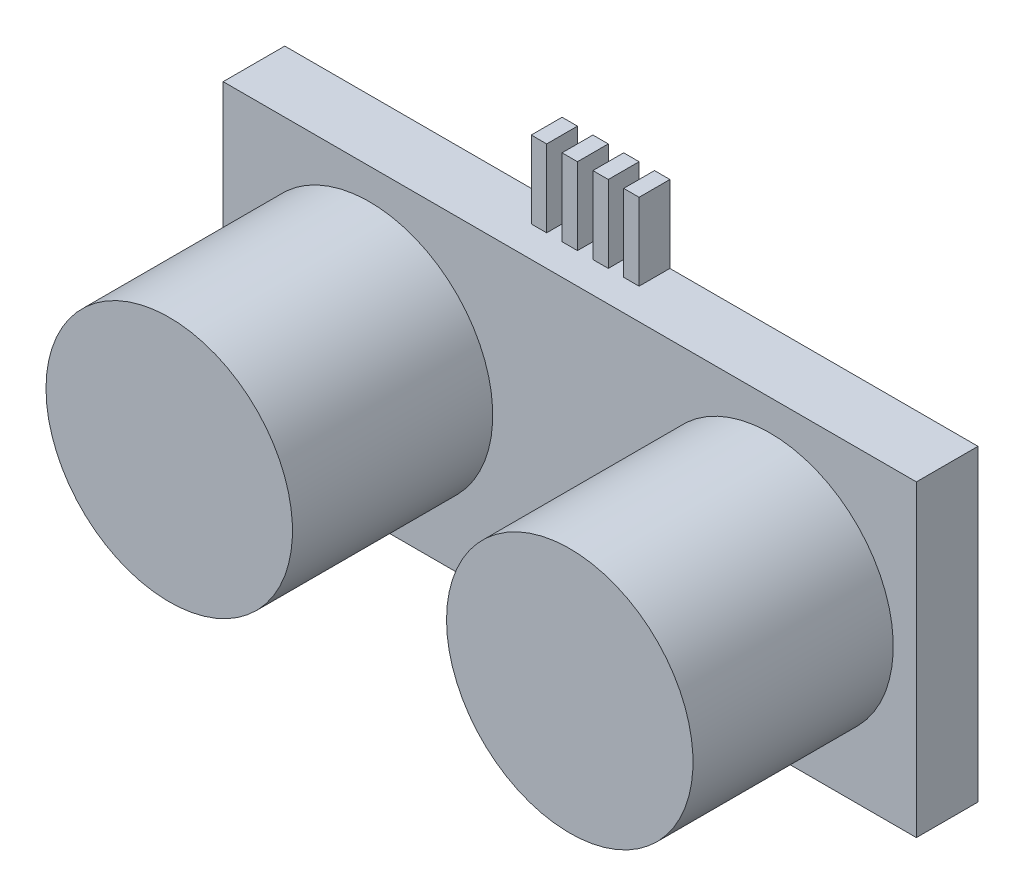
ISO-10303-21;
HEADER;
FILE_DESCRIPTION(('STEP AP214'),'2;1');
FILE_NAME('part.step','',(''),(''),'','','');
FILE_SCHEMA(('AUTOMOTIVE_DESIGN { 1 0 10303 214 1 1 1 1 }'));
ENDSEC;
DATA;
#1=APPLICATION_CONTEXT('core data for automotive mechanical design processes');
#2=APPLICATION_PROTOCOL_DEFINITION('international standard','automotive_design',2000,#1);
#3=PRODUCT_CONTEXT('',#1,'mechanical');
#4=PRODUCT('Part','Part','',(#3));
#5=PRODUCT_RELATED_PRODUCT_CATEGORY('part','',(#4));
#6=PRODUCT_DEFINITION_FORMATION('','',#4);
#7=PRODUCT_DEFINITION_CONTEXT('part definition',#1,'design');
#8=PRODUCT_DEFINITION('design','',#6,#7);
#9=PRODUCT_DEFINITION_SHAPE('','',#8);
#10=(LENGTH_UNIT() NAMED_UNIT(*) SI_UNIT(.MILLI.,.METRE.));
#11=(NAMED_UNIT(*) PLANE_ANGLE_UNIT() SI_UNIT($,.RADIAN.));
#12=(NAMED_UNIT(*) SI_UNIT($,.STERADIAN.) SOLID_ANGLE_UNIT());
#13=UNCERTAINTY_MEASURE_WITH_UNIT(LENGTH_MEASURE(1.E-05),#10,'distance_accuracy_value','');
#14=(GEOMETRIC_REPRESENTATION_CONTEXT(3) GLOBAL_UNCERTAINTY_ASSIGNED_CONTEXT((#13)) GLOBAL_UNIT_ASSIGNED_CONTEXT((#10,
#11,#12)) REPRESENTATION_CONTEXT('',''));
#15=CARTESIAN_POINT('',(0.,0.,0.));
#16=DIRECTION('',(0.,0.,1.));
#17=DIRECTION('',(1.,0.,0.));
#18=AXIS2_PLACEMENT_3D('',#15,#16,#17);
#19=CARTESIAN_POINT('',(-22.5,10.,4.));
#20=DIRECTION('',(0.,-1.,0.));
#21=DIRECTION('',(0.,0.,-1.));
#22=AXIS2_PLACEMENT_3D('',#19,#20,#21);
#23=PLANE('',#22);
#24=DIRECTION('',(-1.,0.,0.));
#25=VECTOR('',#24,1.);
#26=CARTESIAN_POINT('',(2.5,9.99999999999999,2.));
#27=LINE('',#26,#25);
#28=CARTESIAN_POINT('',(2.5,10.,2.));
#29=VERTEX_POINT('',#28);
#30=CARTESIAN_POINT('',(1.5,10.,2.));
#31=VERTEX_POINT('',#30);
#32=EDGE_CURVE('E52',#29,#31,#27,.T.);
#33=ORIENTED_EDGE('',*,*,#32,.T.);
#34=DIRECTION('',(0.,0.,-1.));
#35=VECTOR('',#34,1.);
#36=CARTESIAN_POINT('',(1.5,9.99999999999999,2.));
#37=LINE('',#36,#35);
#38=CARTESIAN_POINT('',(1.5,9.99999999999999,0.));
#39=VERTEX_POINT('',#38);
#40=EDGE_CURVE('E202',#31,#39,#37,.T.);
#41=ORIENTED_EDGE('',*,*,#40,.T.);
#42=DIRECTION('',(-1.,0.,0.));
#43=VECTOR('',#42,1.);
#44=CARTESIAN_POINT('',(-22.5,10.,0.));
#45=LINE('',#44,#43);
#46=CARTESIAN_POINT('',(0.499999999999999,10.,0.));
#47=VERTEX_POINT('',#46);
#48=EDGE_CURVE('E319',#39,#47,#45,.T.);
#49=ORIENTED_EDGE('',*,*,#48,.T.);
#50=DIRECTION('',(0.,0.,-1.));
#51=VECTOR('',#50,1.);
#52=CARTESIAN_POINT('',(0.499999999999999,10.,2.));
#53=LINE('',#52,#51);
#54=CARTESIAN_POINT('',(0.499999999999999,10.,2.));
#55=VERTEX_POINT('',#54);
#56=EDGE_CURVE('E292',#55,#47,#53,.T.);
#57=ORIENTED_EDGE('',*,*,#56,.F.);
#58=DIRECTION('',(-1.,0.,0.));
#59=VECTOR('',#58,1.);
#60=CARTESIAN_POINT('',(0.499999999999999,10.,2.));
#61=LINE('',#60,#59);
#62=CARTESIAN_POINT('',(-0.500000000000001,10.,2.));
#63=VERTEX_POINT('',#62);
#64=EDGE_CURVE('E271',#55,#63,#61,.T.);
#65=ORIENTED_EDGE('',*,*,#64,.T.);
#66=DIRECTION('',(0.,0.,-1.));
#67=VECTOR('',#66,1.);
#68=CARTESIAN_POINT('',(-0.500000000000001,10.,2.));
#69=LINE('',#68,#67);
#70=CARTESIAN_POINT('',(-0.500000000000007,10.,0.));
#71=VERTEX_POINT('',#70);
#72=EDGE_CURVE('E289',#63,#71,#69,.T.);
#73=ORIENTED_EDGE('',*,*,#72,.T.);
#74=CARTESIAN_POINT('',(-1.50000000000001,10.,0.));
#75=VERTEX_POINT('',#74);
#76=EDGE_CURVE('E320',#71,#75,#45,.T.);
#77=ORIENTED_EDGE('',*,*,#76,.T.);
#78=DIRECTION('',(0.,0.,-1.));
#79=VECTOR('',#78,1.);
#80=CARTESIAN_POINT('',(-1.5,10.,2.));
#81=LINE('',#80,#79);
#82=CARTESIAN_POINT('',(-1.5,10.,2.));
#83=VERTEX_POINT('',#82);
#84=EDGE_CURVE('E261',#83,#75,#81,.T.);
#85=ORIENTED_EDGE('',*,*,#84,.F.);
#86=DIRECTION('',(-1.,0.,0.));
#87=VECTOR('',#86,1.);
#88=CARTESIAN_POINT('',(-1.5,10.,2.));
#89=LINE('',#88,#87);
#90=CARTESIAN_POINT('',(-2.5,10.,2.));
#91=VERTEX_POINT('',#90);
#92=EDGE_CURVE('E241',#83,#91,#89,.T.);
#93=ORIENTED_EDGE('',*,*,#92,.T.);
#94=DIRECTION('',(0.,0.,-1.));
#95=VECTOR('',#94,1.);
#96=CARTESIAN_POINT('',(-2.5,10.,2.));
#97=LINE('',#96,#95);
#98=CARTESIAN_POINT('',(-2.5,10.,0.));
#99=VERTEX_POINT('',#98);
#100=EDGE_CURVE('E258',#91,#99,#97,.T.);
#101=ORIENTED_EDGE('',*,*,#100,.T.);
#102=CARTESIAN_POINT('',(-3.50000000000001,10.,0.));
#103=VERTEX_POINT('',#102);
#104=EDGE_CURVE('E379',#99,#103,#45,.T.);
#105=ORIENTED_EDGE('',*,*,#104,.T.);
#106=DIRECTION('',(0.,0.,-1.));
#107=VECTOR('',#106,1.);
#108=CARTESIAN_POINT('',(-3.5,10.,2.));
#109=LINE('',#108,#107);
#110=CARTESIAN_POINT('',(-3.5,10.,2.));
#111=VERTEX_POINT('',#110);
#112=EDGE_CURVE('E231',#111,#103,#109,.T.);
#113=ORIENTED_EDGE('',*,*,#112,.F.);
#114=DIRECTION('',(-1.,0.,0.));
#115=VECTOR('',#114,1.);
#116=CARTESIAN_POINT('',(-3.5,10.,2.));
#117=LINE('',#116,#115);
#118=CARTESIAN_POINT('',(-4.5,10.,2.));
#119=VERTEX_POINT('',#118);
#120=EDGE_CURVE('E211',#111,#119,#117,.T.);
#121=ORIENTED_EDGE('',*,*,#120,.T.);
#122=DIRECTION('',(0.,0.,-1.));
#123=VECTOR('',#122,1.);
#124=CARTESIAN_POINT('',(-4.5,10.,2.));
#125=LINE('',#124,#123);
#126=CARTESIAN_POINT('',(-4.5,10.,0.));
#127=VERTEX_POINT('',#126);
#128=EDGE_CURVE('E228',#119,#127,#125,.T.);
#129=ORIENTED_EDGE('',*,*,#128,.T.);
#130=CARTESIAN_POINT('',(-22.5,10.,0.));
#131=VERTEX_POINT('',#130);
#132=EDGE_CURVE('E315',#127,#131,#45,.T.);
#133=ORIENTED_EDGE('',*,*,#132,.T.);
#134=DIRECTION('',(0.,0.,-1.));
#135=VECTOR('',#134,1.);
#136=CARTESIAN_POINT('',(-22.5,10.,4.));
#137=LINE('',#136,#135);
#138=CARTESIAN_POINT('',(-22.5,10.,4.));
#139=VERTEX_POINT('',#138);
#140=EDGE_CURVE('E328',#139,#131,#137,.T.);
#141=ORIENTED_EDGE('',*,*,#140,.F.);
#142=DIRECTION('',(-1.,0.,0.));
#143=VECTOR('',#142,1.);
#144=CARTESIAN_POINT('',(-22.5,10.,4.));
#145=LINE('',#144,#143);
#146=CARTESIAN_POINT('',(22.5,10.,4.));
#147=VERTEX_POINT('',#146);
#148=EDGE_CURVE('E305',#147,#139,#145,.T.);
#149=ORIENTED_EDGE('',*,*,#148,.F.);
#150=DIRECTION('',(0.,0.,-1.));
#151=VECTOR('',#150,1.);
#152=CARTESIAN_POINT('',(22.5,10.,4.));
#153=LINE('',#152,#151);
#154=CARTESIAN_POINT('',(22.5,10.,0.));
#155=VERTEX_POINT('',#154);
#156=EDGE_CURVE('E331',#147,#155,#153,.T.);
#157=ORIENTED_EDGE('',*,*,#156,.T.);
#158=CARTESIAN_POINT('',(2.49999999999999,10.,0.));
#159=VERTEX_POINT('',#158);
#160=EDGE_CURVE('E316',#155,#159,#45,.T.);
#161=ORIENTED_EDGE('',*,*,#160,.T.);
#162=DIRECTION('',(0.,0.,-1.));
#163=VECTOR('',#162,1.);
#164=CARTESIAN_POINT('',(2.5,9.99999999999999,2.));
#165=LINE('',#164,#163);
#166=EDGE_CURVE('E48',#29,#159,#165,.T.);
#167=ORIENTED_EDGE('',*,*,#166,.F.);
#168=EDGE_LOOP('',(#33,#41,#49,#57,#65,#73,#77,#85,#93,#101,#105,#113,#121,#129,#133,#141,#149,
#157,#161,#167));
#169=FACE_BOUND('',#168,.T.);
#170=ADVANCED_FACE('F33',(#169),#23,.F.);
#171=CARTESIAN_POINT('',(22.5,-10.,4.));
#172=DIRECTION('',(-1.,0.,0.));
#173=DIRECTION('',(0.,0.,1.));
#174=AXIS2_PLACEMENT_3D('',#171,#172,#173);
#175=PLANE('',#174);
#176=DIRECTION('',(0.,1.,0.));
#177=VECTOR('',#176,1.);
#178=CARTESIAN_POINT('',(22.5,-10.,0.));
#179=LINE('',#178,#177);
#180=CARTESIAN_POINT('',(22.5,-10.,0.));
#181=VERTEX_POINT('',#180);
#182=EDGE_CURVE('E301',#181,#155,#179,.T.);
#183=ORIENTED_EDGE('',*,*,#182,.T.);
#184=ORIENTED_EDGE('',*,*,#156,.F.);
#185=DIRECTION('',(0.,1.,0.));
#186=VECTOR('',#185,1.);
#187=CARTESIAN_POINT('',(22.5,-10.,4.));
#188=LINE('',#187,#186);
#189=CARTESIAN_POINT('',(22.5,-10.,4.));
#190=VERTEX_POINT('',#189);
#191=EDGE_CURVE('E302',#190,#147,#188,.T.);
#192=ORIENTED_EDGE('',*,*,#191,.F.);
#193=DIRECTION('',(0.,0.,-1.));
#194=VECTOR('',#193,1.);
#195=CARTESIAN_POINT('',(22.5,-10.,4.));
#196=LINE('',#195,#194);
#197=EDGE_CURVE('E312',#190,#181,#196,.T.);
#198=ORIENTED_EDGE('',*,*,#197,.T.);
#199=EDGE_LOOP('',(#183,#184,#192,#198));
#200=FACE_BOUND('',#199,.T.);
#201=ADVANCED_FACE('F35',(#200),#175,.F.);
#202=CARTESIAN_POINT('',(-22.5,-10.,4.));
#203=DIRECTION('',(1.,0.,0.));
#204=DIRECTION('',(0.,0.,-1.));
#205=AXIS2_PLACEMENT_3D('',#202,#203,#204);
#206=PLANE('',#205);
#207=DIRECTION('',(0.,-1.,0.));
#208=VECTOR('',#207,1.);
#209=CARTESIAN_POINT('',(-22.5,-10.,0.));
#210=LINE('',#209,#208);
#211=CARTESIAN_POINT('',(-22.5,-10.,0.));
#212=VERTEX_POINT('',#211);
#213=EDGE_CURVE('E318',#131,#212,#210,.T.);
#214=ORIENTED_EDGE('',*,*,#213,.T.);
#215=DIRECTION('',(0.,0.,-1.));
#216=VECTOR('',#215,1.);
#217=CARTESIAN_POINT('',(-22.5,-10.,4.));
#218=LINE('',#217,#216);
#219=CARTESIAN_POINT('',(-22.5,-10.,4.));
#220=VERTEX_POINT('',#219);
#221=EDGE_CURVE('E325',#220,#212,#218,.T.);
#222=ORIENTED_EDGE('',*,*,#221,.F.);
#223=DIRECTION('',(0.,-1.,0.));
#224=VECTOR('',#223,1.);
#225=CARTESIAN_POINT('',(-22.5,-10.,4.));
#226=LINE('',#225,#224);
#227=EDGE_CURVE('E308',#139,#220,#226,.T.);
#228=ORIENTED_EDGE('',*,*,#227,.F.);
#229=ORIENTED_EDGE('',*,*,#140,.T.);
#230=EDGE_LOOP('',(#214,#222,#228,#229));
#231=FACE_BOUND('',#230,.T.);
#232=ADVANCED_FACE('F356',(#231),#206,.F.);
#233=CARTESIAN_POINT('',(-22.5,-10.,4.));
#234=DIRECTION('',(0.,1.,0.));
#235=DIRECTION('',(0.,0.,1.));
#236=AXIS2_PLACEMENT_3D('',#233,#234,#235);
#237=PLANE('',#236);
#238=DIRECTION('',(1.,0.,0.));
#239=VECTOR('',#238,1.);
#240=CARTESIAN_POINT('',(-22.5,-10.,0.));
#241=LINE('',#240,#239);
#242=EDGE_CURVE('E306',#212,#181,#241,.T.);
#243=ORIENTED_EDGE('',*,*,#242,.T.);
#244=ORIENTED_EDGE('',*,*,#197,.F.);
#245=DIRECTION('',(1.,0.,0.));
#246=VECTOR('',#245,1.);
#247=CARTESIAN_POINT('',(-22.5,-10.,4.));
#248=LINE('',#247,#246);
#249=EDGE_CURVE('E310',#220,#190,#248,.T.);
#250=ORIENTED_EDGE('',*,*,#249,.F.);
#251=ORIENTED_EDGE('',*,*,#221,.T.);
#252=EDGE_LOOP('',(#243,#244,#250,#251));
#253=FACE_BOUND('',#252,.T.);
#254=ADVANCED_FACE('F342',(#253),#237,.F.);
#255=CARTESIAN_POINT('',(0.,0.,4.));
#256=DIRECTION('',(0.,0.,-1.));
#257=DIRECTION('',(-1.,0.,0.));
#258=AXIS2_PLACEMENT_3D('',#255,#256,#257);
#259=PLANE('',#258);
#260=CARTESIAN_POINT('',(13.,0.,4.));
#261=DIRECTION('',(0.,0.,-1.));
#262=DIRECTION('',(-1.,0.,0.));
#263=AXIS2_PLACEMENT_3D('',#260,#261,#262);
#264=CIRCLE('',#263,8.);
#265=CARTESIAN_POINT('',(5.,0.,4.));
#266=VERTEX_POINT('',#265);
#267=EDGE_CURVE('E11',#266,#266,#264,.F.);
#268=ORIENTED_EDGE('',*,*,#267,.F.);
#269=EDGE_LOOP('',(#268));
#270=FACE_BOUND('',#269,.T.);
#271=CARTESIAN_POINT('',(-13.,0.,4.));
#272=DIRECTION('',(0.,0.,-1.));
#273=DIRECTION('',(-1.,0.,0.));
#274=AXIS2_PLACEMENT_3D('',#271,#272,#273);
#275=CIRCLE('',#274,8.);
#276=CARTESIAN_POINT('',(-21.,0.,4.));
#277=VERTEX_POINT('',#276);
#278=EDGE_CURVE('E41',#277,#277,#275,.F.);
#279=ORIENTED_EDGE('',*,*,#278,.F.);
#280=EDGE_LOOP('',(#279));
#281=FACE_BOUND('',#280,.T.);
#282=ORIENTED_EDGE('',*,*,#191,.T.);
#283=ORIENTED_EDGE('',*,*,#148,.T.);
#284=ORIENTED_EDGE('',*,*,#227,.T.);
#285=ORIENTED_EDGE('',*,*,#249,.T.);
#286=EDGE_LOOP('',(#282,#283,#284,#285));
#287=FACE_BOUND('',#286,.T.);
#288=ADVANCED_FACE('F338',(#270,#281,#287),#259,.F.);
#289=CARTESIAN_POINT('',(0.,0.,0.));
#290=DIRECTION('',(0.,0.,-1.));
#291=DIRECTION('',(-1.,0.,0.));
#292=AXIS2_PLACEMENT_3D('',#289,#290,#291);
#293=PLANE('',#292);
#294=ORIENTED_EDGE('',*,*,#182,.F.);
#295=ORIENTED_EDGE('',*,*,#242,.F.);
#296=ORIENTED_EDGE('',*,*,#213,.F.);
#297=ORIENTED_EDGE('',*,*,#132,.F.);
#298=DIRECTION('',(0.,1.,0.));
#299=VECTOR('',#298,1.);
#300=CARTESIAN_POINT('',(-4.5,10.,0.));
#301=LINE('',#300,#299);
#302=CARTESIAN_POINT('',(-4.5,15.,0.));
#303=VERTEX_POINT('',#302);
#304=EDGE_CURVE('E208',#127,#303,#301,.T.);
#305=ORIENTED_EDGE('',*,*,#304,.T.);
#306=DIRECTION('',(1.,0.,0.));
#307=VECTOR('',#306,1.);
#308=CARTESIAN_POINT('',(-4.,15.,0.));
#309=LINE('',#308,#307);
#310=CARTESIAN_POINT('',(-3.5,15.,0.));
#311=VERTEX_POINT('',#310);
#312=EDGE_CURVE('E201',#303,#311,#309,.T.);
#313=ORIENTED_EDGE('',*,*,#312,.T.);
#314=DIRECTION('',(0.,-1.,0.));
#315=VECTOR('',#314,1.);
#316=CARTESIAN_POINT('',(-3.5,15.,0.));
#317=LINE('',#316,#315);
#318=EDGE_CURVE('E219',#311,#103,#317,.T.);
#319=ORIENTED_EDGE('',*,*,#318,.T.);
#320=ORIENTED_EDGE('',*,*,#104,.F.);
#321=DIRECTION('',(0.,1.,0.));
#322=VECTOR('',#321,1.);
#323=CARTESIAN_POINT('',(-2.5,10.,0.));
#324=LINE('',#323,#322);
#325=CARTESIAN_POINT('',(-2.5,15.,0.));
#326=VERTEX_POINT('',#325);
#327=EDGE_CURVE('E238',#99,#326,#324,.T.);
#328=ORIENTED_EDGE('',*,*,#327,.T.);
#329=DIRECTION('',(1.,0.,0.));
#330=VECTOR('',#329,1.);
#331=CARTESIAN_POINT('',(-2.,15.,0.));
#332=LINE('',#331,#330);
#333=CARTESIAN_POINT('',(-1.5,15.,0.));
#334=VERTEX_POINT('',#333);
#335=EDGE_CURVE('E227',#326,#334,#332,.T.);
#336=ORIENTED_EDGE('',*,*,#335,.T.);
#337=DIRECTION('',(0.,-1.,0.));
#338=VECTOR('',#337,1.);
#339=CARTESIAN_POINT('',(-1.5,15.,0.));
#340=LINE('',#339,#338);
#341=EDGE_CURVE('E249',#334,#75,#340,.T.);
#342=ORIENTED_EDGE('',*,*,#341,.T.);
#343=ORIENTED_EDGE('',*,*,#76,.F.);
#344=DIRECTION('',(0.,1.,0.));
#345=VECTOR('',#344,1.);
#346=CARTESIAN_POINT('',(-0.500000000000001,10.,0.));
#347=LINE('',#346,#345);
#348=CARTESIAN_POINT('',(-0.500000000000001,15.,0.));
#349=VERTEX_POINT('',#348);
#350=EDGE_CURVE('E268',#71,#349,#347,.T.);
#351=ORIENTED_EDGE('',*,*,#350,.T.);
#352=DIRECTION('',(1.,0.,0.));
#353=VECTOR('',#352,1.);
#354=CARTESIAN_POINT('',(0.,15.,0.));
#355=LINE('',#354,#353);
#356=CARTESIAN_POINT('',(0.5,15.,0.));
#357=VERTEX_POINT('',#356);
#358=EDGE_CURVE('E257',#349,#357,#355,.T.);
#359=ORIENTED_EDGE('',*,*,#358,.T.);
#360=DIRECTION('',(0.,-1.,0.));
#361=VECTOR('',#360,1.);
#362=CARTESIAN_POINT('',(0.5,15.,0.));
#363=LINE('',#362,#361);
#364=EDGE_CURVE('E280',#357,#47,#363,.T.);
#365=ORIENTED_EDGE('',*,*,#364,.T.);
#366=ORIENTED_EDGE('',*,*,#48,.F.);
#367=DIRECTION('',(0.,1.,0.));
#368=VECTOR('',#367,1.);
#369=CARTESIAN_POINT('',(1.5,9.99999999999999,0.));
#370=LINE('',#369,#368);
#371=CARTESIAN_POINT('',(1.5,15.,0.));
#372=VERTEX_POINT('',#371);
#373=EDGE_CURVE('E180',#39,#372,#370,.T.);
#374=ORIENTED_EDGE('',*,*,#373,.T.);
#375=DIRECTION('',(1.,0.,0.));
#376=VECTOR('',#375,1.);
#377=CARTESIAN_POINT('',(2.,15.,0.));
#378=LINE('',#377,#376);
#379=CARTESIAN_POINT('',(2.5,15.,0.));
#380=VERTEX_POINT('',#379);
#381=EDGE_CURVE('E195',#372,#380,#378,.T.);
#382=ORIENTED_EDGE('',*,*,#381,.T.);
#383=DIRECTION('',(0.,-1.,0.));
#384=VECTOR('',#383,1.);
#385=CARTESIAN_POINT('',(2.5,15.,0.));
#386=LINE('',#385,#384);
#387=EDGE_CURVE('E186',#380,#159,#386,.T.);
#388=ORIENTED_EDGE('',*,*,#387,.T.);
#389=ORIENTED_EDGE('',*,*,#160,.F.);
#390=EDGE_LOOP('',(#294,#295,#296,#297,#305,#313,#319,#320,#328,#336,#342,#343,#351,#359,#365,
#366,#374,#382,#388,#389));
#391=FACE_BOUND('',#390,.T.);
#392=ADVANCED_FACE('F341',(#391),#293,.T.);
#393=CARTESIAN_POINT('',(-13.,0.,17.));
#394=DIRECTION('',(0.,0.,-1.));
#395=DIRECTION('',(-1.,0.,0.));
#396=AXIS2_PLACEMENT_3D('',#393,#394,#395);
#397=CYLINDRICAL_SURFACE('',#396,8.);
#398=CARTESIAN_POINT('',(-13.,0.,17.));
#399=DIRECTION('',(0.,0.,1.));
#400=DIRECTION('',(1.,0.,0.));
#401=AXIS2_PLACEMENT_3D('',#398,#399,#400);
#402=CIRCLE('',#401,8.);
#403=CARTESIAN_POINT('',(-21.,0.,17.));
#404=VERTEX_POINT('',#403);
#405=EDGE_CURVE('E298',#404,#404,#402,.T.);
#406=CARTESIAN_POINT('',(-21.,0.,17.));
#407=CARTESIAN_POINT('',(-21.,0.,16.8645833333333));
#408=CARTESIAN_POINT('',(-21.,0.,16.7291666666667));
#409=CARTESIAN_POINT('',(-21.,0.,16.4583333333333));
#410=CARTESIAN_POINT('',(-21.,0.,16.3229166666667));
#411=CARTESIAN_POINT('',(-21.,0.,16.0520833333333));
#412=CARTESIAN_POINT('',(-21.,0.,15.9166666666667));
#413=CARTESIAN_POINT('',(-21.,0.,15.6458333333333));
#414=CARTESIAN_POINT('',(-21.,0.,15.5104166666667));
#415=CARTESIAN_POINT('',(-21.,0.,15.2395833333333));
#416=CARTESIAN_POINT('',(-21.,0.,15.1041666666667));
#417=CARTESIAN_POINT('',(-21.,0.,14.8333333333333));
#418=CARTESIAN_POINT('',(-21.,0.,14.6979166666667));
#419=CARTESIAN_POINT('',(-21.,0.,14.4270833333333));
#420=CARTESIAN_POINT('',(-21.,0.,14.2916666666667));
#421=CARTESIAN_POINT('',(-21.,0.,14.0208333333333));
#422=CARTESIAN_POINT('',(-21.,0.,13.8854166666667));
#423=CARTESIAN_POINT('',(-21.,0.,13.6145833333333));
#424=CARTESIAN_POINT('',(-21.,0.,13.4791666666667));
#425=CARTESIAN_POINT('',(-21.,0.,13.2083333333333));
#426=CARTESIAN_POINT('',(-21.,0.,13.0729166666667));
#427=CARTESIAN_POINT('',(-21.,0.,12.8020833333333));
#428=CARTESIAN_POINT('',(-21.,0.,12.6666666666667));
#429=CARTESIAN_POINT('',(-21.,0.,12.3958333333333));
#430=CARTESIAN_POINT('',(-21.,0.,12.2604166666667));
#431=CARTESIAN_POINT('',(-21.,0.,11.9895833333333));
#432=CARTESIAN_POINT('',(-21.,0.,11.8541666666667));
#433=CARTESIAN_POINT('',(-21.,0.,11.5833333333333));
#434=CARTESIAN_POINT('',(-21.,0.,11.4479166666667));
#435=CARTESIAN_POINT('',(-21.,0.,11.1770833333333));
#436=CARTESIAN_POINT('',(-21.,0.,11.0416666666667));
#437=CARTESIAN_POINT('',(-21.,0.,10.7708333333333));
#438=CARTESIAN_POINT('',(-21.,0.,10.6354166666667));
#439=CARTESIAN_POINT('',(-21.,0.,10.3645833333333));
#440=CARTESIAN_POINT('',(-21.,0.,10.2291666666667));
#441=CARTESIAN_POINT('',(-21.,0.,9.95833333333333));
#442=CARTESIAN_POINT('',(-21.,0.,9.82291666666667));
#443=CARTESIAN_POINT('',(-21.,0.,9.55208333333333));
#444=CARTESIAN_POINT('',(-21.,0.,9.41666666666667));
#445=CARTESIAN_POINT('',(-21.,0.,9.14583333333333));
#446=CARTESIAN_POINT('',(-21.,0.,9.01041666666667));
#447=CARTESIAN_POINT('',(-21.,0.,8.73958333333334));
#448=CARTESIAN_POINT('',(-21.,0.,8.60416666666667));
#449=CARTESIAN_POINT('',(-21.,0.,8.33333333333334));
#450=CARTESIAN_POINT('',(-21.,0.,8.19791666666667));
#451=CARTESIAN_POINT('',(-21.,0.,7.92708333333333));
#452=CARTESIAN_POINT('',(-21.,0.,7.79166666666667));
#453=CARTESIAN_POINT('',(-21.,0.,7.52083333333333));
#454=CARTESIAN_POINT('',(-21.,0.,7.38541666666667));
#455=CARTESIAN_POINT('',(-21.,0.,7.11458333333333));
#456=CARTESIAN_POINT('',(-21.,0.,6.97916666666667));
#457=CARTESIAN_POINT('',(-21.,0.,6.70833333333333));
#458=CARTESIAN_POINT('',(-21.,0.,6.57291666666667));
#459=CARTESIAN_POINT('',(-21.,0.,6.30208333333334));
#460=CARTESIAN_POINT('',(-21.,0.,6.16666666666667));
#461=CARTESIAN_POINT('',(-21.,0.,5.89583333333334));
#462=CARTESIAN_POINT('',(-21.,0.,5.76041666666667));
#463=CARTESIAN_POINT('',(-21.,0.,5.48958333333333));
#464=CARTESIAN_POINT('',(-21.,0.,5.35416666666667));
#465=CARTESIAN_POINT('',(-21.,0.,5.08333333333333));
#466=CARTESIAN_POINT('',(-21.,0.,4.94791666666667));
#467=CARTESIAN_POINT('',(-21.,0.,4.67708333333334));
#468=CARTESIAN_POINT('',(-21.,0.,4.54166666666667));
#469=CARTESIAN_POINT('',(-21.,0.,4.27083333333334));
#470=CARTESIAN_POINT('',(-21.,0.,4.13541666666667));
#471=CARTESIAN_POINT('',(-21.,0.,4.));
#472=B_SPLINE_CURVE_WITH_KNOTS('',3,(#406,#407,#408,#409,#410,#411,#412,#413,#414,#415,#416,
#417,#418,#419,#420,#421,#422,#423,#424,#425,#426,#427,#428,#429,#430,#431,#432,#433,#434,#435,
#436,#437,#438,#439,#440,#441,#442,#443,#444,#445,#446,#447,#448,#449,#450,#451,#452,#453,#454,
#455,#456,#457,#458,#459,#460,#461,#462,#463,#464,#465,#466,#467,#468,#469,#470,#471),
.UNSPECIFIED.,.F.,.F.,(4,2,2,2,2,2,2,2,2,2,2,2,2,2,2,2,2,2,2,2,2,2,2,2,2,2,2,2,2,2,2,2,4),(0.,
0.406249999999997,0.812499999999997,1.21875,1.625,2.03125,2.4375,2.84375,3.25,3.65625,4.0625,
4.46875,4.875,5.28125,5.6875,6.09375,6.5,6.90625,7.3125,7.71875,8.125,8.53124999999999,8.9375,
9.34375,9.75,10.15625,10.5625,10.96875,11.375,11.78125,12.1875,12.59375,13.),.UNSPECIFIED.);
#473=EDGE_CURVE('BSEAM336',#404,#277,#472,.T.);
#474=ORIENTED_EDGE('',*,*,#405,.F.);
#475=ORIENTED_EDGE('',*,*,#278,.T.);
#476=ORIENTED_EDGE('',*,*,#473,.T.);
#477=ORIENTED_EDGE('',*,*,#473,.F.);
#478=EDGE_LOOP('',(#474,#476,#475,#477));
#479=FACE_BOUND('',#478,.T.);
#480=ADVANCED_FACE('F336',(#479),#397,.T.);
#481=CARTESIAN_POINT('',(-13.,0.,17.));
#482=DIRECTION('',(0.,0.,1.));
#483=DIRECTION('',(1.,0.,0.));
#484=AXIS2_PLACEMENT_3D('',#481,#482,#483);
#485=PLANE('',#484);
#486=ORIENTED_EDGE('',*,*,#405,.T.);
#487=EDGE_LOOP('',(#486));
#488=FACE_BOUND('',#487,.T.);
#489=ADVANCED_FACE('F421',(#488),#485,.T.);
#490=CARTESIAN_POINT('',(13.,0.,17.));
#491=DIRECTION('',(0.,0.,-1.));
#492=DIRECTION('',(-1.,0.,0.));
#493=AXIS2_PLACEMENT_3D('',#490,#491,#492);
#494=CYLINDRICAL_SURFACE('',#493,8.);
#495=CARTESIAN_POINT('',(13.,0.,17.));
#496=DIRECTION('',(0.,0.,1.));
#497=DIRECTION('',(1.,0.,0.));
#498=AXIS2_PLACEMENT_3D('',#495,#496,#497);
#499=CIRCLE('',#498,8.);
#500=CARTESIAN_POINT('',(5.,0.,17.));
#501=VERTEX_POINT('',#500);
#502=EDGE_CURVE('E288',#501,#501,#499,.T.);
#503=CARTESIAN_POINT('',(5.,0.,17.));
#504=CARTESIAN_POINT('',(5.,0.,16.8645833333333));
#505=CARTESIAN_POINT('',(5.,0.,16.7291666666667));
#506=CARTESIAN_POINT('',(5.,0.,16.4583333333333));
#507=CARTESIAN_POINT('',(5.,0.,16.3229166666667));
#508=CARTESIAN_POINT('',(5.,0.,16.0520833333333));
#509=CARTESIAN_POINT('',(5.,0.,15.9166666666667));
#510=CARTESIAN_POINT('',(5.,0.,15.6458333333333));
#511=CARTESIAN_POINT('',(5.,0.,15.5104166666667));
#512=CARTESIAN_POINT('',(5.,0.,15.2395833333333));
#513=CARTESIAN_POINT('',(5.,0.,15.1041666666667));
#514=CARTESIAN_POINT('',(5.,0.,14.8333333333333));
#515=CARTESIAN_POINT('',(5.,0.,14.6979166666667));
#516=CARTESIAN_POINT('',(5.,0.,14.4270833333333));
#517=CARTESIAN_POINT('',(5.,0.,14.2916666666667));
#518=CARTESIAN_POINT('',(5.,0.,14.0208333333333));
#519=CARTESIAN_POINT('',(5.,0.,13.8854166666667));
#520=CARTESIAN_POINT('',(5.,0.,13.6145833333333));
#521=CARTESIAN_POINT('',(5.,0.,13.4791666666667));
#522=CARTESIAN_POINT('',(5.,0.,13.2083333333333));
#523=CARTESIAN_POINT('',(5.,0.,13.0729166666667));
#524=CARTESIAN_POINT('',(5.,0.,12.8020833333333));
#525=CARTESIAN_POINT('',(5.,0.,12.6666666666667));
#526=CARTESIAN_POINT('',(5.,0.,12.3958333333333));
#527=CARTESIAN_POINT('',(5.,0.,12.2604166666667));
#528=CARTESIAN_POINT('',(5.,0.,11.9895833333333));
#529=CARTESIAN_POINT('',(5.,0.,11.8541666666667));
#530=CARTESIAN_POINT('',(5.,0.,11.5833333333333));
#531=CARTESIAN_POINT('',(5.,0.,11.4479166666667));
#532=CARTESIAN_POINT('',(5.,0.,11.1770833333333));
#533=CARTESIAN_POINT('',(5.,0.,11.0416666666667));
#534=CARTESIAN_POINT('',(5.,0.,10.7708333333333));
#535=CARTESIAN_POINT('',(5.,0.,10.6354166666667));
#536=CARTESIAN_POINT('',(5.,0.,10.3645833333333));
#537=CARTESIAN_POINT('',(5.,0.,10.2291666666667));
#538=CARTESIAN_POINT('',(5.,0.,9.95833333333333));
#539=CARTESIAN_POINT('',(5.,0.,9.82291666666667));
#540=CARTESIAN_POINT('',(5.,0.,9.55208333333333));
#541=CARTESIAN_POINT('',(5.,0.,9.41666666666667));
#542=CARTESIAN_POINT('',(5.,0.,9.14583333333333));
#543=CARTESIAN_POINT('',(5.,0.,9.01041666666667));
#544=CARTESIAN_POINT('',(5.,0.,8.73958333333334));
#545=CARTESIAN_POINT('',(5.,0.,8.60416666666667));
#546=CARTESIAN_POINT('',(5.,0.,8.33333333333334));
#547=CARTESIAN_POINT('',(5.,0.,8.19791666666667));
#548=CARTESIAN_POINT('',(5.,0.,7.92708333333333));
#549=CARTESIAN_POINT('',(5.,0.,7.79166666666667));
#550=CARTESIAN_POINT('',(5.,0.,7.52083333333333));
#551=CARTESIAN_POINT('',(5.,0.,7.38541666666667));
#552=CARTESIAN_POINT('',(5.,0.,7.11458333333333));
#553=CARTESIAN_POINT('',(5.,0.,6.97916666666667));
#554=CARTESIAN_POINT('',(5.,0.,6.70833333333333));
#555=CARTESIAN_POINT('',(5.,0.,6.57291666666667));
#556=CARTESIAN_POINT('',(5.,0.,6.30208333333334));
#557=CARTESIAN_POINT('',(5.,0.,6.16666666666667));
#558=CARTESIAN_POINT('',(5.,0.,5.89583333333334));
#559=CARTESIAN_POINT('',(5.,0.,5.76041666666667));
#560=CARTESIAN_POINT('',(5.,0.,5.48958333333333));
#561=CARTESIAN_POINT('',(5.,0.,5.35416666666667));
#562=CARTESIAN_POINT('',(5.,0.,5.08333333333333));
#563=CARTESIAN_POINT('',(5.,0.,4.94791666666667));
#564=CARTESIAN_POINT('',(5.,0.,4.67708333333334));
#565=CARTESIAN_POINT('',(5.,0.,4.54166666666667));
#566=CARTESIAN_POINT('',(5.,0.,4.27083333333334));
#567=CARTESIAN_POINT('',(5.,0.,4.13541666666667));
#568=CARTESIAN_POINT('',(5.,0.,4.));
#569=B_SPLINE_CURVE_WITH_KNOTS('',3,(#503,#504,#505,#506,#507,#508,#509,#510,#511,#512,#513,
#514,#515,#516,#517,#518,#519,#520,#521,#522,#523,#524,#525,#526,#527,#528,#529,#530,#531,#532,
#533,#534,#535,#536,#537,#538,#539,#540,#541,#542,#543,#544,#545,#546,#547,#548,#549,#550,#551,
#552,#553,#554,#555,#556,#557,#558,#559,#560,#561,#562,#563,#564,#565,#566,#567,#568),
.UNSPECIFIED.,.F.,.F.,(4,2,2,2,2,2,2,2,2,2,2,2,2,2,2,2,2,2,2,2,2,2,2,2,2,2,2,2,2,2,2,2,4),(0.,
0.406249999999997,0.812499999999997,1.21875,1.625,2.03125,2.4375,2.84375,3.25,3.65625,4.0625,
4.46875,4.875,5.28125,5.6875,6.09375,6.5,6.90625,7.3125,7.71875,8.125,8.53124999999999,8.9375,
9.34375,9.75,10.15625,10.5625,10.96875,11.375,11.78125,12.1875,12.59375,13.),.UNSPECIFIED.);
#570=EDGE_CURVE('BSEAM425',#501,#266,#569,.T.);
#571=ORIENTED_EDGE('',*,*,#502,.F.);
#572=ORIENTED_EDGE('',*,*,#267,.T.);
#573=ORIENTED_EDGE('',*,*,#570,.T.);
#574=ORIENTED_EDGE('',*,*,#570,.F.);
#575=EDGE_LOOP('',(#571,#573,#572,#574));
#576=FACE_BOUND('',#575,.T.);
#577=ADVANCED_FACE('F425',(#576),#494,.T.);
#578=CARTESIAN_POINT('',(13.,0.,17.));
#579=DIRECTION('',(0.,0.,1.));
#580=DIRECTION('',(1.,0.,0.));
#581=AXIS2_PLACEMENT_3D('',#578,#579,#580);
#582=PLANE('',#581);
#583=ORIENTED_EDGE('',*,*,#502,.T.);
#584=EDGE_LOOP('',(#583));
#585=FACE_BOUND('',#584,.T.);
#586=ADVANCED_FACE('F429',(#585),#582,.T.);
#587=CARTESIAN_POINT('',(-0.500000000000001,10.,2.));
#588=DIRECTION('',(-1.,0.,0.));
#589=DIRECTION('',(0.,0.,1.));
#590=AXIS2_PLACEMENT_3D('',#587,#588,#589);
#591=PLANE('',#590);
#592=ORIENTED_EDGE('',*,*,#350,.F.);
#593=ORIENTED_EDGE('',*,*,#72,.F.);
#594=DIRECTION('',(0.,1.,0.));
#595=VECTOR('',#594,1.);
#596=CARTESIAN_POINT('',(-0.500000000000001,10.,2.));
#597=LINE('',#596,#595);
#598=CARTESIAN_POINT('',(-0.500000000000001,15.,2.));
#599=VERTEX_POINT('',#598);
#600=EDGE_CURVE('E274',#63,#599,#597,.T.);
#601=ORIENTED_EDGE('',*,*,#600,.T.);
#602=DIRECTION('',(0.,0.,-1.));
#603=VECTOR('',#602,1.);
#604=CARTESIAN_POINT('',(-0.500000000000001,15.,2.));
#605=LINE('',#604,#603);
#606=EDGE_CURVE('E285',#599,#349,#605,.T.);
#607=ORIENTED_EDGE('',*,*,#606,.T.);
#608=EDGE_LOOP('',(#592,#593,#601,#607));
#609=FACE_BOUND('',#608,.T.);
#610=ADVANCED_FACE('F374',(#609),#591,.T.);
#611=CARTESIAN_POINT('',(0.5,15.,2.));
#612=DIRECTION('',(1.,0.,0.));
#613=DIRECTION('',(0.,1.,0.));
#614=AXIS2_PLACEMENT_3D('',#611,#612,#613);
#615=PLANE('',#614);
#616=ORIENTED_EDGE('',*,*,#364,.F.);
#617=DIRECTION('',(0.,0.,-1.));
#618=VECTOR('',#617,1.);
#619=CARTESIAN_POINT('',(0.5,15.,2.));
#620=LINE('',#619,#618);
#621=CARTESIAN_POINT('',(0.5,15.,2.));
#622=VERTEX_POINT('',#621);
#623=EDGE_CURVE('E277',#622,#357,#620,.T.);
#624=ORIENTED_EDGE('',*,*,#623,.F.);
#625=DIRECTION('',(0.,-1.,0.));
#626=VECTOR('',#625,1.);
#627=CARTESIAN_POINT('',(0.5,15.,2.));
#628=LINE('',#627,#626);
#629=EDGE_CURVE('E267',#622,#55,#628,.T.);
#630=ORIENTED_EDGE('',*,*,#629,.T.);
#631=ORIENTED_EDGE('',*,*,#56,.T.);
#632=EDGE_LOOP('',(#616,#624,#630,#631));
#633=FACE_BOUND('',#632,.T.);
#634=ADVANCED_FACE('F366',(#633),#615,.T.);
#635=CARTESIAN_POINT('',(0.,15.,2.));
#636=DIRECTION('',(0.,1.,0.));
#637=DIRECTION('',(0.,0.,1.));
#638=AXIS2_PLACEMENT_3D('',#635,#636,#637);
#639=PLANE('',#638);
#640=ORIENTED_EDGE('',*,*,#358,.F.);
#641=ORIENTED_EDGE('',*,*,#606,.F.);
#642=DIRECTION('',(1.,0.,0.));
#643=VECTOR('',#642,1.);
#644=CARTESIAN_POINT('',(-0.500000000000001,15.,2.));
#645=LINE('',#644,#643);
#646=EDGE_CURVE('E265',#599,#622,#645,.T.);
#647=ORIENTED_EDGE('',*,*,#646,.T.);
#648=ORIENTED_EDGE('',*,*,#623,.T.);
#649=EDGE_LOOP('',(#640,#641,#647,#648));
#650=FACE_BOUND('',#649,.T.);
#651=ADVANCED_FACE('F371',(#650),#639,.T.);
#652=CARTESIAN_POINT('',(0.,0.,2.));
#653=DIRECTION('',(0.,0.,-1.));
#654=DIRECTION('',(-1.,0.,0.));
#655=AXIS2_PLACEMENT_3D('',#652,#653,#654);
#656=PLANE('',#655);
#657=ORIENTED_EDGE('',*,*,#646,.F.);
#658=ORIENTED_EDGE('',*,*,#600,.F.);
#659=ORIENTED_EDGE('',*,*,#64,.F.);
#660=ORIENTED_EDGE('',*,*,#629,.F.);
#661=EDGE_LOOP('',(#657,#658,#659,#660));
#662=FACE_BOUND('',#661,.T.);
#663=ADVANCED_FACE('F377',(#662),#656,.F.);
#664=CARTESIAN_POINT('',(-2.5,10.,2.));
#665=DIRECTION('',(-1.,0.,0.));
#666=DIRECTION('',(0.,0.,1.));
#667=AXIS2_PLACEMENT_3D('',#664,#665,#666);
#668=PLANE('',#667);
#669=ORIENTED_EDGE('',*,*,#327,.F.);
#670=ORIENTED_EDGE('',*,*,#100,.F.);
#671=DIRECTION('',(0.,1.,0.));
#672=VECTOR('',#671,1.);
#673=CARTESIAN_POINT('',(-2.5,10.,2.));
#674=LINE('',#673,#672);
#675=CARTESIAN_POINT('',(-2.5,15.,2.));
#676=VERTEX_POINT('',#675);
#677=EDGE_CURVE('E243',#91,#676,#674,.T.);
#678=ORIENTED_EDGE('',*,*,#677,.T.);
#679=DIRECTION('',(0.,0.,-1.));
#680=VECTOR('',#679,1.);
#681=CARTESIAN_POINT('',(-2.5,15.,2.));
#682=LINE('',#681,#680);
#683=EDGE_CURVE('E254',#676,#326,#682,.T.);
#684=ORIENTED_EDGE('',*,*,#683,.T.);
#685=EDGE_LOOP('',(#669,#670,#678,#684));
#686=FACE_BOUND('',#685,.T.);
#687=ADVANCED_FACE('F442',(#686),#668,.T.);
#688=CARTESIAN_POINT('',(-1.5,15.,2.));
#689=DIRECTION('',(1.,0.,0.));
#690=DIRECTION('',(0.,1.,0.));
#691=AXIS2_PLACEMENT_3D('',#688,#689,#690);
#692=PLANE('',#691);
#693=ORIENTED_EDGE('',*,*,#341,.F.);
#694=DIRECTION('',(0.,0.,-1.));
#695=VECTOR('',#694,1.);
#696=CARTESIAN_POINT('',(-1.5,15.,2.));
#697=LINE('',#696,#695);
#698=CARTESIAN_POINT('',(-1.5,15.,2.));
#699=VERTEX_POINT('',#698);
#700=EDGE_CURVE('E246',#699,#334,#697,.T.);
#701=ORIENTED_EDGE('',*,*,#700,.F.);
#702=DIRECTION('',(0.,-1.,0.));
#703=VECTOR('',#702,1.);
#704=CARTESIAN_POINT('',(-1.5,15.,2.));
#705=LINE('',#704,#703);
#706=EDGE_CURVE('E237',#699,#83,#705,.T.);
#707=ORIENTED_EDGE('',*,*,#706,.T.);
#708=ORIENTED_EDGE('',*,*,#84,.T.);
#709=EDGE_LOOP('',(#693,#701,#707,#708));
#710=FACE_BOUND('',#709,.T.);
#711=ADVANCED_FACE('F447',(#710),#692,.T.);
#712=CARTESIAN_POINT('',(-2.,15.,2.));
#713=DIRECTION('',(0.,1.,0.));
#714=DIRECTION('',(0.,0.,1.));
#715=AXIS2_PLACEMENT_3D('',#712,#713,#714);
#716=PLANE('',#715);
#717=ORIENTED_EDGE('',*,*,#335,.F.);
#718=ORIENTED_EDGE('',*,*,#683,.F.);
#719=DIRECTION('',(1.,0.,0.));
#720=VECTOR('',#719,1.);
#721=CARTESIAN_POINT('',(-2.5,15.,2.));
#722=LINE('',#721,#720);
#723=EDGE_CURVE('E235',#676,#699,#722,.T.);
#724=ORIENTED_EDGE('',*,*,#723,.T.);
#725=ORIENTED_EDGE('',*,*,#700,.T.);
#726=EDGE_LOOP('',(#717,#718,#724,#725));
#727=FACE_BOUND('',#726,.T.);
#728=ADVANCED_FACE('F443',(#727),#716,.T.);
#729=CARTESIAN_POINT('',(0.,0.,2.));
#730=DIRECTION('',(0.,0.,-1.));
#731=DIRECTION('',(-1.,0.,0.));
#732=AXIS2_PLACEMENT_3D('',#729,#730,#731);
#733=PLANE('',#732);
#734=ORIENTED_EDGE('',*,*,#723,.F.);
#735=ORIENTED_EDGE('',*,*,#677,.F.);
#736=ORIENTED_EDGE('',*,*,#92,.F.);
#737=ORIENTED_EDGE('',*,*,#706,.F.);
#738=EDGE_LOOP('',(#734,#735,#736,#737));
#739=FACE_BOUND('',#738,.T.);
#740=ADVANCED_FACE('F446',(#739),#733,.F.);
#741=CARTESIAN_POINT('',(-4.5,10.,2.));
#742=DIRECTION('',(-1.,0.,0.));
#743=DIRECTION('',(0.,0.,1.));
#744=AXIS2_PLACEMENT_3D('',#741,#742,#743);
#745=PLANE('',#744);
#746=ORIENTED_EDGE('',*,*,#304,.F.);
#747=ORIENTED_EDGE('',*,*,#128,.F.);
#748=DIRECTION('',(0.,1.,0.));
#749=VECTOR('',#748,1.);
#750=CARTESIAN_POINT('',(-4.5,10.,2.));
#751=LINE('',#750,#749);
#752=CARTESIAN_POINT('',(-4.5,15.,2.));
#753=VERTEX_POINT('',#752);
#754=EDGE_CURVE('E213',#119,#753,#751,.T.);
#755=ORIENTED_EDGE('',*,*,#754,.T.);
#756=DIRECTION('',(0.,0.,-1.));
#757=VECTOR('',#756,1.);
#758=CARTESIAN_POINT('',(-4.5,15.,2.));
#759=LINE('',#758,#757);
#760=EDGE_CURVE('E224',#753,#303,#759,.T.);
#761=ORIENTED_EDGE('',*,*,#760,.T.);
#762=EDGE_LOOP('',(#746,#747,#755,#761));
#763=FACE_BOUND('',#762,.T.);
#764=ADVANCED_FACE('F393',(#763),#745,.T.);
#765=CARTESIAN_POINT('',(-3.5,15.,2.));
#766=DIRECTION('',(1.,0.,0.));
#767=DIRECTION('',(0.,1.,0.));
#768=AXIS2_PLACEMENT_3D('',#765,#766,#767);
#769=PLANE('',#768);
#770=ORIENTED_EDGE('',*,*,#318,.F.);
#771=DIRECTION('',(0.,0.,-1.));
#772=VECTOR('',#771,1.);
#773=CARTESIAN_POINT('',(-3.5,15.,2.));
#774=LINE('',#773,#772);
#775=CARTESIAN_POINT('',(-3.5,15.,2.));
#776=VERTEX_POINT('',#775);
#777=EDGE_CURVE('E216',#776,#311,#774,.T.);
#778=ORIENTED_EDGE('',*,*,#777,.F.);
#779=DIRECTION('',(0.,-1.,0.));
#780=VECTOR('',#779,1.);
#781=CARTESIAN_POINT('',(-3.5,15.,2.));
#782=LINE('',#781,#780);
#783=EDGE_CURVE('E207',#776,#111,#782,.T.);
#784=ORIENTED_EDGE('',*,*,#783,.T.);
#785=ORIENTED_EDGE('',*,*,#112,.T.);
#786=EDGE_LOOP('',(#770,#778,#784,#785));
#787=FACE_BOUND('',#786,.T.);
#788=ADVANCED_FACE('F385',(#787),#769,.T.);
#789=CARTESIAN_POINT('',(-4.,15.,2.));
#790=DIRECTION('',(0.,1.,0.));
#791=DIRECTION('',(0.,0.,1.));
#792=AXIS2_PLACEMENT_3D('',#789,#790,#791);
#793=PLANE('',#792);
#794=ORIENTED_EDGE('',*,*,#312,.F.);
#795=ORIENTED_EDGE('',*,*,#760,.F.);
#796=DIRECTION('',(1.,0.,0.));
#797=VECTOR('',#796,1.);
#798=CARTESIAN_POINT('',(-4.5,15.,2.));
#799=LINE('',#798,#797);
#800=EDGE_CURVE('E205',#753,#776,#799,.T.);
#801=ORIENTED_EDGE('',*,*,#800,.T.);
#802=ORIENTED_EDGE('',*,*,#777,.T.);
#803=EDGE_LOOP('',(#794,#795,#801,#802));
#804=FACE_BOUND('',#803,.T.);
#805=ADVANCED_FACE('F390',(#804),#793,.T.);
#806=CARTESIAN_POINT('',(0.,0.,2.));
#807=DIRECTION('',(0.,0.,-1.));
#808=DIRECTION('',(-1.,0.,0.));
#809=AXIS2_PLACEMENT_3D('',#806,#807,#808);
#810=PLANE('',#809);
#811=ORIENTED_EDGE('',*,*,#800,.F.);
#812=ORIENTED_EDGE('',*,*,#754,.F.);
#813=ORIENTED_EDGE('',*,*,#120,.F.);
#814=ORIENTED_EDGE('',*,*,#783,.F.);
#815=EDGE_LOOP('',(#811,#812,#813,#814));
#816=FACE_BOUND('',#815,.T.);
#817=ADVANCED_FACE('F397',(#816),#810,.F.);
#818=CARTESIAN_POINT('',(1.5,9.99999999999999,2.));
#819=DIRECTION('',(-1.,0.,0.));
#820=DIRECTION('',(0.,0.,1.));
#821=AXIS2_PLACEMENT_3D('',#818,#819,#820);
#822=PLANE('',#821);
#823=ORIENTED_EDGE('',*,*,#373,.F.);
#824=ORIENTED_EDGE('',*,*,#40,.F.);
#825=DIRECTION('',(0.,1.,0.));
#826=VECTOR('',#825,1.);
#827=CARTESIAN_POINT('',(1.5,9.99999999999999,2.));
#828=LINE('',#827,#826);
#829=CARTESIAN_POINT('',(1.5,15.,2.));
#830=VERTEX_POINT('',#829);
#831=EDGE_CURVE('E188',#31,#830,#828,.T.);
#832=ORIENTED_EDGE('',*,*,#831,.T.);
#833=DIRECTION('',(0.,0.,-1.));
#834=VECTOR('',#833,1.);
#835=CARTESIAN_POINT('',(1.5,15.,2.));
#836=LINE('',#835,#834);
#837=EDGE_CURVE('E174',#830,#372,#836,.T.);
#838=ORIENTED_EDGE('',*,*,#837,.T.);
#839=EDGE_LOOP('',(#823,#824,#832,#838));
#840=FACE_BOUND('',#839,.T.);
#841=ADVANCED_FACE('F362',(#840),#822,.T.);
#842=CARTESIAN_POINT('',(2.5,15.,2.));
#843=DIRECTION('',(1.,0.,0.));
#844=DIRECTION('',(0.,1.,0.));
#845=AXIS2_PLACEMENT_3D('',#842,#843,#844);
#846=PLANE('',#845);
#847=ORIENTED_EDGE('',*,*,#387,.F.);
#848=DIRECTION('',(0.,0.,-1.));
#849=VECTOR('',#848,1.);
#850=CARTESIAN_POINT('',(2.5,15.,2.));
#851=LINE('',#850,#849);
#852=CARTESIAN_POINT('',(2.5,15.,2.));
#853=VERTEX_POINT('',#852);
#854=EDGE_CURVE('E171',#853,#380,#851,.T.);
#855=ORIENTED_EDGE('',*,*,#854,.F.);
#856=DIRECTION('',(0.,-1.,0.));
#857=VECTOR('',#856,1.);
#858=CARTESIAN_POINT('',(2.5,15.,2.));
#859=LINE('',#858,#857);
#860=EDGE_CURVE('E179',#853,#29,#859,.T.);
#861=ORIENTED_EDGE('',*,*,#860,.T.);
#862=ORIENTED_EDGE('',*,*,#166,.T.);
#863=EDGE_LOOP('',(#847,#855,#861,#862));
#864=FACE_BOUND('',#863,.T.);
#865=ADVANCED_FACE('F184',(#864),#846,.T.);
#866=CARTESIAN_POINT('',(2.,15.,2.));
#867=DIRECTION('',(0.,1.,0.));
#868=DIRECTION('',(0.,0.,1.));
#869=AXIS2_PLACEMENT_3D('',#866,#867,#868);
#870=PLANE('',#869);
#871=ORIENTED_EDGE('',*,*,#381,.F.);
#872=ORIENTED_EDGE('',*,*,#837,.F.);
#873=DIRECTION('',(1.,0.,0.));
#874=VECTOR('',#873,1.);
#875=CARTESIAN_POINT('',(1.5,15.,2.));
#876=LINE('',#875,#874);
#877=EDGE_CURVE('E168',#830,#853,#876,.T.);
#878=ORIENTED_EDGE('',*,*,#877,.T.);
#879=ORIENTED_EDGE('',*,*,#854,.T.);
#880=EDGE_LOOP('',(#871,#872,#878,#879));
#881=FACE_BOUND('',#880,.T.);
#882=ADVANCED_FACE('F170',(#881),#870,.T.);
#883=CARTESIAN_POINT('',(0.,0.,2.));
#884=DIRECTION('',(0.,0.,-1.));
#885=DIRECTION('',(-1.,0.,0.));
#886=AXIS2_PLACEMENT_3D('',#883,#884,#885);
#887=PLANE('',#886);
#888=ORIENTED_EDGE('',*,*,#877,.F.);
#889=ORIENTED_EDGE('',*,*,#831,.F.);
#890=ORIENTED_EDGE('',*,*,#32,.F.);
#891=ORIENTED_EDGE('',*,*,#860,.F.);
#892=EDGE_LOOP('',(#888,#889,#890,#891));
#893=FACE_BOUND('',#892,.T.);
#894=ADVANCED_FACE('F190',(#893),#887,.F.);
#895=CLOSED_SHELL('',(#170,#201,#232,#254,#288,#392,#480,#489,#577,#586,#610,#634,#651,#663,
#687,#711,#728,#740,#764,#788,#805,#817,#841,#865,#882,#894));
#896=MANIFOLD_SOLID_BREP('B2',#895);
#897=ADVANCED_BREP_SHAPE_REPRESENTATION('',(#18,#896),#14);
#898=SHAPE_DEFINITION_REPRESENTATION(#9,#897);
ENDSEC;
END-ISO-10303-21;
